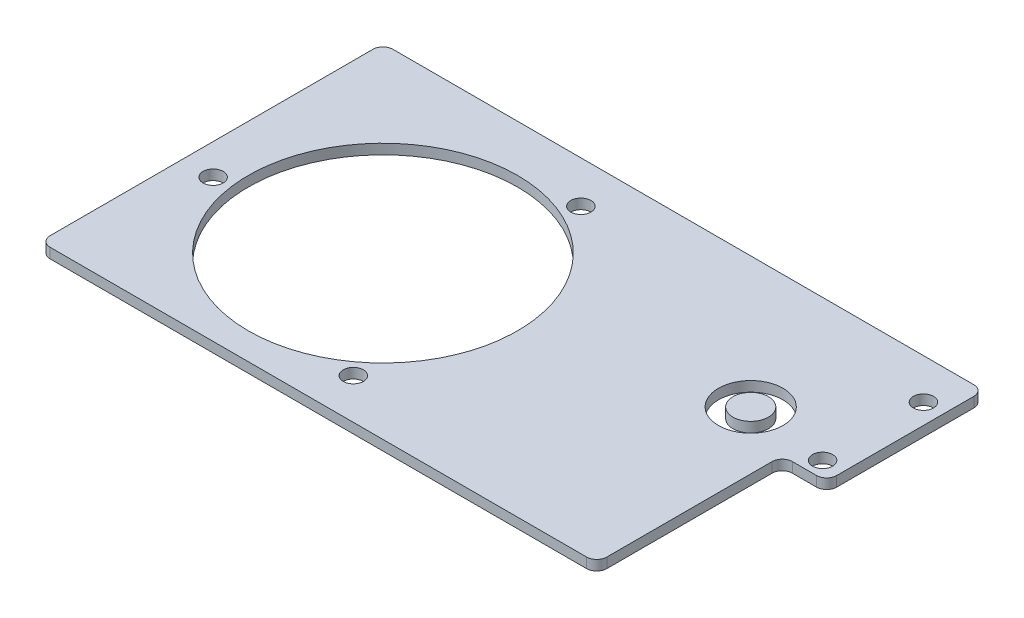
ISO-10303-21;
HEADER;
FILE_DESCRIPTION(('STEP AP214'),'2;1');
FILE_NAME('part.step','',(''),(''),'','','');
FILE_SCHEMA(('AUTOMOTIVE_DESIGN { 1 0 10303 214 1 1 1 1 }'));
ENDSEC;
DATA;
#1=APPLICATION_CONTEXT('core data for automotive mechanical design processes');
#2=APPLICATION_PROTOCOL_DEFINITION('international standard','automotive_design',2000,#1);
#3=PRODUCT_CONTEXT('',#1,'mechanical');
#4=PRODUCT('Part','Part','',(#3));
#5=PRODUCT_RELATED_PRODUCT_CATEGORY('part','',(#4));
#6=PRODUCT_DEFINITION_FORMATION('','',#4);
#7=PRODUCT_DEFINITION_CONTEXT('part definition',#1,'design');
#8=PRODUCT_DEFINITION('design','',#6,#7);
#9=PRODUCT_DEFINITION_SHAPE('','',#8);
#10=(LENGTH_UNIT() NAMED_UNIT(*) SI_UNIT(.MILLI.,.METRE.));
#11=(NAMED_UNIT(*) PLANE_ANGLE_UNIT() SI_UNIT($,.RADIAN.));
#12=(NAMED_UNIT(*) SI_UNIT($,.STERADIAN.) SOLID_ANGLE_UNIT());
#13=UNCERTAINTY_MEASURE_WITH_UNIT(LENGTH_MEASURE(1.E-05),#10,'distance_accuracy_value','');
#14=(GEOMETRIC_REPRESENTATION_CONTEXT(3) GLOBAL_UNCERTAINTY_ASSIGNED_CONTEXT((#13)) GLOBAL_UNIT_ASSIGNED_CONTEXT((#10,
#11,#12)) REPRESENTATION_CONTEXT('',''));
#15=CARTESIAN_POINT('',(0.,0.,0.));
#16=DIRECTION('',(0.,0.,1.));
#17=DIRECTION('',(1.,0.,0.));
#18=AXIS2_PLACEMENT_3D('',#15,#16,#17);
#19=CARTESIAN_POINT('',(242.57,6.35,-8.89000000000004));
#20=DIRECTION('',(0.,-1.,0.));
#21=DIRECTION('',(0.,0.,-1.));
#22=AXIS2_PLACEMENT_3D('',#19,#20,#21);
#23=PLANE('',#22);
#24=CARTESIAN_POINT('',(199.663269188543,6.35,-31.9495832888387));
#25=DIRECTION('',(0.,1.,0.));
#26=DIRECTION('',(0.,0.,1.));
#27=AXIS2_PLACEMENT_3D('',#24,#25,#26);
#28=CIRCLE('',#27,20.32);
#29=CARTESIAN_POINT('',(199.663269188543,6.35,-11.6295832888387));
#30=VERTEX_POINT('',#29);
#31=EDGE_CURVE('E12',#30,#30,#28,.T.);
#32=ORIENTED_EDGE('',*,*,#31,.F.);
#33=EDGE_LOOP('',(#32));
#34=FACE_BOUND('',#33,.T.);
#35=CARTESIAN_POINT('',(242.57,6.35,-8.89000000000004));
#36=DIRECTION('',(0.,-1.,0.));
#37=DIRECTION('',(0.,0.,-1.));
#38=AXIS2_PLACEMENT_3D('',#35,#36,#37);
#39=CIRCLE('',#38,6.35);
#40=CARTESIAN_POINT('',(236.22,6.35,-8.89000000000004));
#41=VERTEX_POINT('',#40);
#42=CARTESIAN_POINT('',(242.57,6.35,-15.24));
#43=VERTEX_POINT('',#42);
#44=EDGE_CURVE('E135',#41,#43,#39,.T.);
#45=ORIENTED_EDGE('',*,*,#44,.T.);
#46=DIRECTION('',(1.,0.,0.));
#47=VECTOR('',#46,1.);
#48=CARTESIAN_POINT('',(242.57,6.35,-15.24));
#49=LINE('',#48,#47);
#50=CARTESIAN_POINT('',(257.81,6.35,-15.2400000000001));
#51=VERTEX_POINT('',#50);
#52=EDGE_CURVE('E128',#43,#51,#49,.T.);
#53=ORIENTED_EDGE('',*,*,#52,.T.);
#54=CARTESIAN_POINT('',(257.81,6.35,-21.59));
#55=DIRECTION('',(0.,1.,0.));
#56=DIRECTION('',(0.,0.,1.));
#57=AXIS2_PLACEMENT_3D('',#54,#55,#56);
#58=CIRCLE('',#57,6.34999999999995);
#59=CARTESIAN_POINT('',(264.16,6.35,-21.59));
#60=VERTEX_POINT('',#59);
#61=EDGE_CURVE('E132',#51,#60,#58,.T.);
#62=ORIENTED_EDGE('',*,*,#61,.T.);
#63=DIRECTION('',(0.,0.,-1.));
#64=VECTOR('',#63,1.);
#65=CARTESIAN_POINT('',(264.16,6.35,-107.95));
#66=LINE('',#65,#64);
#67=CARTESIAN_POINT('',(264.16,6.35,-107.95));
#68=VERTEX_POINT('',#67);
#69=EDGE_CURVE('E153',#60,#68,#66,.T.);
#70=ORIENTED_EDGE('',*,*,#69,.T.);
#71=CARTESIAN_POINT('',(257.81,6.35,-107.95));
#72=DIRECTION('',(0.,1.,0.));
#73=DIRECTION('',(0.,0.,-1.));
#74=AXIS2_PLACEMENT_3D('',#71,#72,#73);
#75=CIRCLE('',#74,6.35000000000002);
#76=CARTESIAN_POINT('',(257.81,6.35,-114.3));
#77=VERTEX_POINT('',#76);
#78=EDGE_CURVE('E155',#68,#77,#75,.T.);
#79=ORIENTED_EDGE('',*,*,#78,.T.);
#80=DIRECTION('',(-1.,0.,0.));
#81=VECTOR('',#80,1.);
#82=CARTESIAN_POINT('',(257.81,6.35,-114.3));
#83=LINE('',#82,#81);
#84=CARTESIAN_POINT('',(-107.95,6.35,-114.3));
#85=VERTEX_POINT('',#84);
#86=EDGE_CURVE('E262',#77,#85,#83,.T.);
#87=ORIENTED_EDGE('',*,*,#86,.T.);
#88=CARTESIAN_POINT('',(-107.95,6.35,-107.95));
#89=DIRECTION('',(0.,1.,0.));
#90=DIRECTION('',(0.,0.,1.));
#91=AXIS2_PLACEMENT_3D('',#88,#89,#90);
#92=CIRCLE('',#91,6.34999999999995);
#93=CARTESIAN_POINT('',(-114.3,6.35,-107.95));
#94=VERTEX_POINT('',#93);
#95=EDGE_CURVE('E260',#85,#94,#92,.T.);
#96=ORIENTED_EDGE('',*,*,#95,.T.);
#97=DIRECTION('',(0.,0.,1.));
#98=VECTOR('',#97,1.);
#99=CARTESIAN_POINT('',(-114.3,6.35,-107.95));
#100=LINE('',#99,#98);
#101=CARTESIAN_POINT('',(-114.3,6.35,95.2500000000002));
#102=VERTEX_POINT('',#101);
#103=EDGE_CURVE('E258',#94,#102,#100,.T.);
#104=ORIENTED_EDGE('',*,*,#103,.T.);
#105=CARTESIAN_POINT('',(-107.95,6.35,95.2500000000002));
#106=DIRECTION('',(0.,1.,0.));
#107=DIRECTION('',(0.,0.,-1.));
#108=AXIS2_PLACEMENT_3D('',#105,#106,#107);
#109=CIRCLE('',#108,6.34999999999996);
#110=CARTESIAN_POINT('',(-107.95,6.35,101.6));
#111=VERTEX_POINT('',#110);
#112=EDGE_CURVE('E256',#102,#111,#109,.T.);
#113=ORIENTED_EDGE('',*,*,#112,.T.);
#114=DIRECTION('',(1.,0.,0.));
#115=VECTOR('',#114,1.);
#116=CARTESIAN_POINT('',(229.87,6.35,101.6));
#117=LINE('',#116,#115);
#118=CARTESIAN_POINT('',(229.87,6.35,101.6));
#119=VERTEX_POINT('',#118);
#120=EDGE_CURVE('E254',#111,#119,#117,.T.);
#121=ORIENTED_EDGE('',*,*,#120,.T.);
#122=CARTESIAN_POINT('',(229.87,6.35,95.25));
#123=DIRECTION('',(0.,1.,0.));
#124=DIRECTION('',(0.,0.,1.));
#125=AXIS2_PLACEMENT_3D('',#122,#123,#124);
#126=CIRCLE('',#125,6.34999999999999);
#127=CARTESIAN_POINT('',(236.22,6.35,95.25));
#128=VERTEX_POINT('',#127);
#129=EDGE_CURVE('E252',#119,#128,#126,.T.);
#130=ORIENTED_EDGE('',*,*,#129,.T.);
#131=DIRECTION('',(0.,0.,-1.));
#132=VECTOR('',#131,1.);
#133=CARTESIAN_POINT('',(236.22,6.35,95.25));
#134=LINE('',#133,#132);
#135=EDGE_CURVE('E190',#128,#41,#134,.T.);
#136=ORIENTED_EDGE('',*,*,#135,.T.);
#137=EDGE_LOOP('',(#45,#53,#62,#70,#79,#87,#96,#104,#113,#121,#130,#136));
#138=FACE_BOUND('',#137,.T.);
#139=CARTESIAN_POINT('',(0.,6.35,0.));
#140=DIRECTION('',(0.,1.,0.));
#141=DIRECTION('',(0.,0.,1.));
#142=AXIS2_PLACEMENT_3D('',#139,#140,#141);
#143=CIRCLE('',#142,84.7725);
#144=CARTESIAN_POINT('',(0.,6.35,84.7725));
#145=VERTEX_POINT('',#144);
#146=EDGE_CURVE('E165',#145,#145,#143,.T.);
#147=ORIENTED_EDGE('',*,*,#146,.F.);
#148=EDGE_LOOP('',(#147));
#149=FACE_BOUND('',#148,.T.);
#150=CARTESIAN_POINT('',(-94.8681670844926,6.35,12.0662470574992));
#151=DIRECTION('',(0.,1.,0.));
#152=DIRECTION('',(0.,0.,1.));
#153=AXIS2_PLACEMENT_3D('',#150,#151,#152);
#154=CIRCLE('',#153,6.35);
#155=CARTESIAN_POINT('',(-94.8681670844926,6.35,18.4162470574992));
#156=VERTEX_POINT('',#155);
#157=EDGE_CURVE('E168',#156,#156,#154,.T.);
#158=ORIENTED_EDGE('',*,*,#157,.F.);
#159=EDGE_LOOP('',(#158));
#160=FACE_BOUND('',#159,.T.);
#161=CARTESIAN_POINT('',(251.46,6.35,-88.9000000000001));
#162=DIRECTION('',(0.,1.,0.));
#163=DIRECTION('',(0.,0.,1.));
#164=AXIS2_PLACEMENT_3D('',#161,#162,#163);
#165=CIRCLE('',#164,6.35);
#166=CARTESIAN_POINT('',(251.46,6.35,-82.5500000000001));
#167=VERTEX_POINT('',#166);
#168=EDGE_CURVE('E175',#167,#167,#165,.T.);
#169=ORIENTED_EDGE('',*,*,#168,.F.);
#170=EDGE_LOOP('',(#169));
#171=FACE_BOUND('',#170,.T.);
#172=CARTESIAN_POINT('',(251.46,6.35,-25.4000000000001));
#173=DIRECTION('',(0.,1.,0.));
#174=DIRECTION('',(0.,0.,1.));
#175=AXIS2_PLACEMENT_3D('',#172,#173,#174);
#176=CIRCLE('',#175,6.35);
#177=CARTESIAN_POINT('',(251.46,6.35,-19.0500000000001));
#178=VERTEX_POINT('',#177);
#179=EDGE_CURVE('E181',#178,#178,#176,.T.);
#180=ORIENTED_EDGE('',*,*,#179,.F.);
#181=EDGE_LOOP('',(#180));
#182=FACE_BOUND('',#181,.T.);
#183=CARTESIAN_POINT('',(36.7916406639406,6.35,-87.8574850383021));
#184=DIRECTION('',(0.,1.,0.));
#185=DIRECTION('',(0.,0.,1.));
#186=AXIS2_PLACEMENT_3D('',#183,#184,#185);
#187=CIRCLE('',#186,6.34999999999998);
#188=CARTESIAN_POINT('',(36.7916406639406,6.35,-81.5074850383022));
#189=VERTEX_POINT('',#188);
#190=EDGE_CURVE('E187',#189,#189,#187,.T.);
#191=ORIENTED_EDGE('',*,*,#190,.F.);
#192=EDGE_LOOP('',(#191));
#193=FACE_BOUND('',#192,.T.);
#194=CARTESIAN_POINT('',(57.4982272256385,6.35,76.125119177117));
#195=DIRECTION('',(0.,1.,0.));
#196=DIRECTION('',(0.,0.,1.));
#197=AXIS2_PLACEMENT_3D('',#194,#195,#196);
#198=CIRCLE('',#197,6.35);
#199=CARTESIAN_POINT('',(57.4982272256385,6.35,82.475119177117));
#200=VERTEX_POINT('',#199);
#201=EDGE_CURVE('E193',#200,#200,#198,.T.);
#202=ORIENTED_EDGE('',*,*,#201,.F.);
#203=EDGE_LOOP('',(#202));
#204=FACE_BOUND('',#203,.T.);
#205=ADVANCED_FACE('F43',(#34,#138,#149,#160,#171,#182,#193,#204),#23,.F.);
#206=CARTESIAN_POINT('',(242.57,0.,-8.89000000000004));
#207=DIRECTION('',(0.,-1.,0.));
#208=DIRECTION('',(0.,0.,-1.));
#209=AXIS2_PLACEMENT_3D('',#206,#207,#208);
#210=PLANE('',#209);
#211=CARTESIAN_POINT('',(199.663269188543,0.,-31.9495832888387));
#212=DIRECTION('',(0.,-1.,0.));
#213=DIRECTION('',(0.,0.,-1.));
#214=AXIS2_PLACEMENT_3D('',#211,#212,#213);
#215=CIRCLE('',#214,20.32);
#216=CARTESIAN_POINT('',(199.663269188543,0.,-52.2695832888387));
#217=VERTEX_POINT('',#216);
#218=EDGE_CURVE('E51',#217,#217,#215,.T.);
#219=ORIENTED_EDGE('',*,*,#218,.F.);
#220=EDGE_LOOP('',(#219));
#221=FACE_BOUND('',#220,.T.);
#222=CARTESIAN_POINT('',(36.7916406639406,0.,-87.8574850383021));
#223=DIRECTION('',(0.,1.,0.));
#224=DIRECTION('',(0.,0.,1.));
#225=AXIS2_PLACEMENT_3D('',#222,#223,#224);
#226=CIRCLE('',#225,6.34999999999998);
#227=CARTESIAN_POINT('',(36.7916406639406,0.,-81.5074850383022));
#228=VERTEX_POINT('',#227);
#229=EDGE_CURVE('E178',#228,#228,#226,.T.);
#230=ORIENTED_EDGE('',*,*,#229,.T.);
#231=EDGE_LOOP('',(#230));
#232=FACE_BOUND('',#231,.T.);
#233=CARTESIAN_POINT('',(251.46,0.,-88.9000000000001));
#234=DIRECTION('',(0.,1.,0.));
#235=DIRECTION('',(0.,0.,1.));
#236=AXIS2_PLACEMENT_3D('',#233,#234,#235);
#237=CIRCLE('',#236,6.35);
#238=CARTESIAN_POINT('',(251.46,0.,-82.5500000000001));
#239=VERTEX_POINT('',#238);
#240=EDGE_CURVE('E164',#239,#239,#237,.T.);
#241=ORIENTED_EDGE('',*,*,#240,.T.);
#242=EDGE_LOOP('',(#241));
#243=FACE_BOUND('',#242,.T.);
#244=CARTESIAN_POINT('',(0.,0.,0.));
#245=DIRECTION('',(0.,1.,0.));
#246=DIRECTION('',(0.,0.,1.));
#247=AXIS2_PLACEMENT_3D('',#244,#245,#246);
#248=CIRCLE('',#247,84.7725);
#249=CARTESIAN_POINT('',(0.,0.,84.7725));
#250=VERTEX_POINT('',#249);
#251=EDGE_CURVE('E160',#250,#250,#248,.T.);
#252=ORIENTED_EDGE('',*,*,#251,.T.);
#253=EDGE_LOOP('',(#252));
#254=FACE_BOUND('',#253,.T.);
#255=CARTESIAN_POINT('',(242.57,0.,-8.89000000000004));
#256=DIRECTION('',(0.,-1.,0.));
#257=DIRECTION('',(0.,0.,-1.));
#258=AXIS2_PLACEMENT_3D('',#255,#256,#257);
#259=CIRCLE('',#258,6.35);
#260=CARTESIAN_POINT('',(236.22,0.,-8.89000000000004));
#261=VERTEX_POINT('',#260);
#262=CARTESIAN_POINT('',(242.57,0.,-15.24));
#263=VERTEX_POINT('',#262);
#264=EDGE_CURVE('E195',#261,#263,#259,.T.);
#265=ORIENTED_EDGE('',*,*,#264,.F.);
#266=DIRECTION('',(0.,0.,-1.));
#267=VECTOR('',#266,1.);
#268=CARTESIAN_POINT('',(236.22,0.,95.25));
#269=LINE('',#268,#267);
#270=CARTESIAN_POINT('',(236.22,0.,95.25));
#271=VERTEX_POINT('',#270);
#272=EDGE_CURVE('E59',#271,#261,#269,.T.);
#273=ORIENTED_EDGE('',*,*,#272,.F.);
#274=CARTESIAN_POINT('',(229.87,0.,95.25));
#275=DIRECTION('',(0.,1.,0.));
#276=DIRECTION('',(0.,0.,1.));
#277=AXIS2_PLACEMENT_3D('',#274,#275,#276);
#278=CIRCLE('',#277,6.34999999999999);
#279=CARTESIAN_POINT('',(229.87,0.,101.6));
#280=VERTEX_POINT('',#279);
#281=EDGE_CURVE('E231',#280,#271,#278,.T.);
#282=ORIENTED_EDGE('',*,*,#281,.F.);
#283=DIRECTION('',(1.,0.,0.));
#284=VECTOR('',#283,1.);
#285=CARTESIAN_POINT('',(229.87,0.,101.6));
#286=LINE('',#285,#284);
#287=CARTESIAN_POINT('',(-107.95,0.,101.6));
#288=VERTEX_POINT('',#287);
#289=EDGE_CURVE('E227',#288,#280,#286,.T.);
#290=ORIENTED_EDGE('',*,*,#289,.F.);
#291=CARTESIAN_POINT('',(-107.95,0.,95.2500000000002));
#292=DIRECTION('',(0.,1.,0.));
#293=DIRECTION('',(0.,0.,-1.));
#294=AXIS2_PLACEMENT_3D('',#291,#292,#293);
#295=CIRCLE('',#294,6.34999999999996);
#296=CARTESIAN_POINT('',(-114.3,0.,95.2500000000002));
#297=VERTEX_POINT('',#296);
#298=EDGE_CURVE('E223',#297,#288,#295,.T.);
#299=ORIENTED_EDGE('',*,*,#298,.F.);
#300=DIRECTION('',(0.,0.,1.));
#301=VECTOR('',#300,1.);
#302=CARTESIAN_POINT('',(-114.3,0.,-107.95));
#303=LINE('',#302,#301);
#304=CARTESIAN_POINT('',(-114.3,0.,-107.95));
#305=VERTEX_POINT('',#304);
#306=EDGE_CURVE('E219',#305,#297,#303,.T.);
#307=ORIENTED_EDGE('',*,*,#306,.F.);
#308=CARTESIAN_POINT('',(-107.95,0.,-107.95));
#309=DIRECTION('',(0.,1.,0.));
#310=DIRECTION('',(0.,0.,1.));
#311=AXIS2_PLACEMENT_3D('',#308,#309,#310);
#312=CIRCLE('',#311,6.34999999999995);
#313=CARTESIAN_POINT('',(-107.95,0.,-114.3));
#314=VERTEX_POINT('',#313);
#315=EDGE_CURVE('E215',#314,#305,#312,.T.);
#316=ORIENTED_EDGE('',*,*,#315,.F.);
#317=DIRECTION('',(-1.,0.,0.));
#318=VECTOR('',#317,1.);
#319=CARTESIAN_POINT('',(257.81,0.,-114.3));
#320=LINE('',#319,#318);
#321=CARTESIAN_POINT('',(257.81,0.,-114.3));
#322=VERTEX_POINT('',#321);
#323=EDGE_CURVE('E211',#322,#314,#320,.T.);
#324=ORIENTED_EDGE('',*,*,#323,.F.);
#325=CARTESIAN_POINT('',(257.81,0.,-107.95));
#326=DIRECTION('',(0.,1.,0.));
#327=DIRECTION('',(0.,0.,-1.));
#328=AXIS2_PLACEMENT_3D('',#325,#326,#327);
#329=CIRCLE('',#328,6.35000000000002);
#330=CARTESIAN_POINT('',(264.16,0.,-107.95));
#331=VERTEX_POINT('',#330);
#332=EDGE_CURVE('E207',#331,#322,#329,.T.);
#333=ORIENTED_EDGE('',*,*,#332,.F.);
#334=DIRECTION('',(0.,0.,-1.));
#335=VECTOR('',#334,1.);
#336=CARTESIAN_POINT('',(264.16,0.,-107.95));
#337=LINE('',#336,#335);
#338=CARTESIAN_POINT('',(264.16,0.,-21.59));
#339=VERTEX_POINT('',#338);
#340=EDGE_CURVE('E146',#339,#331,#337,.T.);
#341=ORIENTED_EDGE('',*,*,#340,.F.);
#342=CARTESIAN_POINT('',(257.81,0.,-21.59));
#343=DIRECTION('',(0.,1.,0.));
#344=DIRECTION('',(0.,0.,1.));
#345=AXIS2_PLACEMENT_3D('',#342,#343,#344);
#346=CIRCLE('',#345,6.34999999999995);
#347=CARTESIAN_POINT('',(257.81,0.,-15.2400000000001));
#348=VERTEX_POINT('',#347);
#349=EDGE_CURVE('E147',#348,#339,#346,.T.);
#350=ORIENTED_EDGE('',*,*,#349,.F.);
#351=DIRECTION('',(1.,0.,0.));
#352=VECTOR('',#351,1.);
#353=CARTESIAN_POINT('',(242.57,0.,-15.24));
#354=LINE('',#353,#352);
#355=EDGE_CURVE('E143',#263,#348,#354,.T.);
#356=ORIENTED_EDGE('',*,*,#355,.F.);
#357=EDGE_LOOP('',(#265,#273,#282,#290,#299,#307,#316,#324,#333,#341,#350,#356));
#358=FACE_BOUND('',#357,.T.);
#359=CARTESIAN_POINT('',(-94.8681670844926,0.,12.0662470574992));
#360=DIRECTION('',(0.,1.,0.));
#361=DIRECTION('',(0.,0.,1.));
#362=AXIS2_PLACEMENT_3D('',#359,#360,#361);
#363=CIRCLE('',#362,6.35);
#364=CARTESIAN_POINT('',(-94.8681670844926,0.,18.4162470574992));
#365=VERTEX_POINT('',#364);
#366=EDGE_CURVE('E163',#365,#365,#363,.T.);
#367=ORIENTED_EDGE('',*,*,#366,.T.);
#368=EDGE_LOOP('',(#367));
#369=FACE_BOUND('',#368,.T.);
#370=CARTESIAN_POINT('',(251.46,0.,-25.4000000000001));
#371=DIRECTION('',(0.,1.,0.));
#372=DIRECTION('',(0.,0.,1.));
#373=AXIS2_PLACEMENT_3D('',#370,#371,#372);
#374=CIRCLE('',#373,6.35);
#375=CARTESIAN_POINT('',(251.46,0.,-19.0500000000001));
#376=VERTEX_POINT('',#375);
#377=EDGE_CURVE('E172',#376,#376,#374,.T.);
#378=ORIENTED_EDGE('',*,*,#377,.T.);
#379=EDGE_LOOP('',(#378));
#380=FACE_BOUND('',#379,.T.);
#381=CARTESIAN_POINT('',(57.4982272256385,0.,76.125119177117));
#382=DIRECTION('',(0.,1.,0.));
#383=DIRECTION('',(0.,0.,1.));
#384=AXIS2_PLACEMENT_3D('',#381,#382,#383);
#385=CIRCLE('',#384,6.35);
#386=CARTESIAN_POINT('',(57.4982272256385,0.,82.475119177117));
#387=VERTEX_POINT('',#386);
#388=EDGE_CURVE('E184',#387,#387,#385,.T.);
#389=ORIENTED_EDGE('',*,*,#388,.T.);
#390=EDGE_LOOP('',(#389));
#391=FACE_BOUND('',#390,.T.);
#392=ADVANCED_FACE('F305',(#221,#232,#243,#254,#358,#369,#380,#391),#210,.T.);
#393=CARTESIAN_POINT('',(242.57,6.35,-8.89000000000004));
#394=DIRECTION('',(0.,-1.,0.));
#395=DIRECTION('',(0.,0.,-1.));
#396=AXIS2_PLACEMENT_3D('',#393,#394,#395);
#397=CYLINDRICAL_SURFACE('',#396,6.35);
#398=ORIENTED_EDGE('',*,*,#264,.T.);
#399=DIRECTION('',(0.,-1.,0.));
#400=VECTOR('',#399,1.);
#401=CARTESIAN_POINT('',(242.57,6.35,-15.24));
#402=LINE('',#401,#400);
#403=EDGE_CURVE('E204',#43,#263,#402,.T.);
#404=ORIENTED_EDGE('',*,*,#403,.F.);
#405=ORIENTED_EDGE('',*,*,#44,.F.);
#406=DIRECTION('',(0.,-1.,0.));
#407=VECTOR('',#406,1.);
#408=CARTESIAN_POINT('',(236.22,6.35,-8.89000000000004));
#409=LINE('',#408,#407);
#410=EDGE_CURVE('E236',#41,#261,#409,.T.);
#411=ORIENTED_EDGE('',*,*,#410,.T.);
#412=EDGE_LOOP('',(#398,#404,#405,#411));
#413=FACE_BOUND('',#412,.T.);
#414=ADVANCED_FACE('F303',(#413),#397,.F.);
#415=CARTESIAN_POINT('',(242.57,6.35,-15.24));
#416=DIRECTION('',(0.,0.,-1.));
#417=DIRECTION('',(-1.,0.,0.));
#418=AXIS2_PLACEMENT_3D('',#415,#416,#417);
#419=PLANE('',#418);
#420=ORIENTED_EDGE('',*,*,#355,.T.);
#421=DIRECTION('',(0.,-1.,0.));
#422=VECTOR('',#421,1.);
#423=CARTESIAN_POINT('',(257.81,6.35,-15.2400000000001));
#424=LINE('',#423,#422);
#425=EDGE_CURVE('E141',#51,#348,#424,.T.);
#426=ORIENTED_EDGE('',*,*,#425,.F.);
#427=ORIENTED_EDGE('',*,*,#52,.F.);
#428=ORIENTED_EDGE('',*,*,#403,.T.);
#429=EDGE_LOOP('',(#420,#426,#427,#428));
#430=FACE_BOUND('',#429,.T.);
#431=ADVANCED_FACE('F142',(#430),#419,.F.);
#432=CARTESIAN_POINT('',(257.81,6.35,-21.59));
#433=DIRECTION('',(0.,-1.,0.));
#434=DIRECTION('',(0.,0.,-1.));
#435=AXIS2_PLACEMENT_3D('',#432,#433,#434);
#436=CYLINDRICAL_SURFACE('',#435,6.34999999999995);
#437=ORIENTED_EDGE('',*,*,#349,.T.);
#438=DIRECTION('',(0.,-1.,0.));
#439=VECTOR('',#438,1.);
#440=CARTESIAN_POINT('',(264.16,6.35,-21.59));
#441=LINE('',#440,#439);
#442=EDGE_CURVE('E151',#60,#339,#441,.T.);
#443=ORIENTED_EDGE('',*,*,#442,.F.);
#444=ORIENTED_EDGE('',*,*,#61,.F.);
#445=ORIENTED_EDGE('',*,*,#425,.T.);
#446=EDGE_LOOP('',(#437,#443,#444,#445));
#447=FACE_BOUND('',#446,.T.);
#448=ADVANCED_FACE('F149',(#447),#436,.T.);
#449=CARTESIAN_POINT('',(264.16,6.35,-107.95));
#450=DIRECTION('',(-1.,0.,0.));
#451=DIRECTION('',(0.,0.,1.));
#452=AXIS2_PLACEMENT_3D('',#449,#450,#451);
#453=PLANE('',#452);
#454=ORIENTED_EDGE('',*,*,#340,.T.);
#455=DIRECTION('',(0.,-1.,0.));
#456=VECTOR('',#455,1.);
#457=CARTESIAN_POINT('',(264.16,6.35,-107.95));
#458=LINE('',#457,#456);
#459=EDGE_CURVE('E208',#68,#331,#458,.T.);
#460=ORIENTED_EDGE('',*,*,#459,.F.);
#461=ORIENTED_EDGE('',*,*,#69,.F.);
#462=ORIENTED_EDGE('',*,*,#442,.T.);
#463=EDGE_LOOP('',(#454,#460,#461,#462));
#464=FACE_BOUND('',#463,.T.);
#465=ADVANCED_FACE('F309',(#464),#453,.F.);
#466=CARTESIAN_POINT('',(257.81,6.35,-107.95));
#467=DIRECTION('',(0.,-1.,0.));
#468=DIRECTION('',(0.,0.,-1.));
#469=AXIS2_PLACEMENT_3D('',#466,#467,#468);
#470=CYLINDRICAL_SURFACE('',#469,6.35000000000002);
#471=ORIENTED_EDGE('',*,*,#332,.T.);
#472=DIRECTION('',(0.,-1.,0.));
#473=VECTOR('',#472,1.);
#474=CARTESIAN_POINT('',(257.81,6.35,-114.3));
#475=LINE('',#474,#473);
#476=EDGE_CURVE('E212',#77,#322,#475,.T.);
#477=ORIENTED_EDGE('',*,*,#476,.F.);
#478=ORIENTED_EDGE('',*,*,#78,.F.);
#479=ORIENTED_EDGE('',*,*,#459,.T.);
#480=EDGE_LOOP('',(#471,#477,#478,#479));
#481=FACE_BOUND('',#480,.T.);
#482=ADVANCED_FACE('F269',(#481),#470,.T.);
#483=CARTESIAN_POINT('',(257.81,6.35,-114.3));
#484=DIRECTION('',(0.,0.,1.));
#485=DIRECTION('',(1.,0.,0.));
#486=AXIS2_PLACEMENT_3D('',#483,#484,#485);
#487=PLANE('',#486);
#488=ORIENTED_EDGE('',*,*,#323,.T.);
#489=DIRECTION('',(0.,-1.,0.));
#490=VECTOR('',#489,1.);
#491=CARTESIAN_POINT('',(-107.95,6.35,-114.3));
#492=LINE('',#491,#490);
#493=EDGE_CURVE('E216',#85,#314,#492,.T.);
#494=ORIENTED_EDGE('',*,*,#493,.F.);
#495=ORIENTED_EDGE('',*,*,#86,.F.);
#496=ORIENTED_EDGE('',*,*,#476,.T.);
#497=EDGE_LOOP('',(#488,#494,#495,#496));
#498=FACE_BOUND('',#497,.T.);
#499=ADVANCED_FACE('F273',(#498),#487,.F.);
#500=CARTESIAN_POINT('',(-107.95,6.35,-107.95));
#501=DIRECTION('',(0.,-1.,0.));
#502=DIRECTION('',(0.,0.,-1.));
#503=AXIS2_PLACEMENT_3D('',#500,#501,#502);
#504=CYLINDRICAL_SURFACE('',#503,6.34999999999995);
#505=ORIENTED_EDGE('',*,*,#315,.T.);
#506=DIRECTION('',(0.,-1.,0.));
#507=VECTOR('',#506,1.);
#508=CARTESIAN_POINT('',(-114.3,6.35,-107.95));
#509=LINE('',#508,#507);
#510=EDGE_CURVE('E220',#94,#305,#509,.T.);
#511=ORIENTED_EDGE('',*,*,#510,.F.);
#512=ORIENTED_EDGE('',*,*,#95,.F.);
#513=ORIENTED_EDGE('',*,*,#493,.T.);
#514=EDGE_LOOP('',(#505,#511,#512,#513));
#515=FACE_BOUND('',#514,.T.);
#516=ADVANCED_FACE('F278',(#515),#504,.T.);
#517=CARTESIAN_POINT('',(-114.3,6.35,-107.95));
#518=DIRECTION('',(1.,0.,0.));
#519=DIRECTION('',(0.,0.,-1.));
#520=AXIS2_PLACEMENT_3D('',#517,#518,#519);
#521=PLANE('',#520);
#522=ORIENTED_EDGE('',*,*,#306,.T.);
#523=DIRECTION('',(0.,-1.,0.));
#524=VECTOR('',#523,1.);
#525=CARTESIAN_POINT('',(-114.3,6.35,95.2500000000002));
#526=LINE('',#525,#524);
#527=EDGE_CURVE('E224',#102,#297,#526,.T.);
#528=ORIENTED_EDGE('',*,*,#527,.F.);
#529=ORIENTED_EDGE('',*,*,#103,.F.);
#530=ORIENTED_EDGE('',*,*,#510,.T.);
#531=EDGE_LOOP('',(#522,#528,#529,#530));
#532=FACE_BOUND('',#531,.T.);
#533=ADVANCED_FACE('F284',(#532),#521,.F.);
#534=CARTESIAN_POINT('',(-107.95,6.35,95.2500000000002));
#535=DIRECTION('',(0.,-1.,0.));
#536=DIRECTION('',(0.,0.,-1.));
#537=AXIS2_PLACEMENT_3D('',#534,#535,#536);
#538=CYLINDRICAL_SURFACE('',#537,6.34999999999996);
#539=ORIENTED_EDGE('',*,*,#298,.T.);
#540=DIRECTION('',(0.,-1.,0.));
#541=VECTOR('',#540,1.);
#542=CARTESIAN_POINT('',(-107.95,6.35,101.6));
#543=LINE('',#542,#541);
#544=EDGE_CURVE('E228',#111,#288,#543,.T.);
#545=ORIENTED_EDGE('',*,*,#544,.F.);
#546=ORIENTED_EDGE('',*,*,#112,.F.);
#547=ORIENTED_EDGE('',*,*,#527,.T.);
#548=EDGE_LOOP('',(#539,#545,#546,#547));
#549=FACE_BOUND('',#548,.T.);
#550=ADVANCED_FACE('F288',(#549),#538,.T.);
#551=CARTESIAN_POINT('',(229.87,6.35,101.6));
#552=DIRECTION('',(0.,0.,-1.));
#553=DIRECTION('',(-1.,0.,0.));
#554=AXIS2_PLACEMENT_3D('',#551,#552,#553);
#555=PLANE('',#554);
#556=ORIENTED_EDGE('',*,*,#289,.T.);
#557=DIRECTION('',(0.,-1.,0.));
#558=VECTOR('',#557,1.);
#559=CARTESIAN_POINT('',(229.87,6.35,101.6));
#560=LINE('',#559,#558);
#561=EDGE_CURVE('E232',#119,#280,#560,.T.);
#562=ORIENTED_EDGE('',*,*,#561,.F.);
#563=ORIENTED_EDGE('',*,*,#120,.F.);
#564=ORIENTED_EDGE('',*,*,#544,.T.);
#565=EDGE_LOOP('',(#556,#562,#563,#564));
#566=FACE_BOUND('',#565,.T.);
#567=ADVANCED_FACE('F293',(#566),#555,.F.);
#568=CARTESIAN_POINT('',(229.87,6.35,95.25));
#569=DIRECTION('',(0.,-1.,0.));
#570=DIRECTION('',(0.,0.,-1.));
#571=AXIS2_PLACEMENT_3D('',#568,#569,#570);
#572=CYLINDRICAL_SURFACE('',#571,6.34999999999999);
#573=ORIENTED_EDGE('',*,*,#281,.T.);
#574=DIRECTION('',(0.,-1.,0.));
#575=VECTOR('',#574,1.);
#576=CARTESIAN_POINT('',(236.22,6.35,95.25));
#577=LINE('',#576,#575);
#578=EDGE_CURVE('E169',#128,#271,#577,.T.);
#579=ORIENTED_EDGE('',*,*,#578,.F.);
#580=ORIENTED_EDGE('',*,*,#129,.F.);
#581=ORIENTED_EDGE('',*,*,#561,.T.);
#582=EDGE_LOOP('',(#573,#579,#580,#581));
#583=FACE_BOUND('',#582,.T.);
#584=ADVANCED_FACE('F298',(#583),#572,.T.);
#585=CARTESIAN_POINT('',(236.22,6.35,95.25));
#586=DIRECTION('',(-1.,0.,0.));
#587=DIRECTION('',(0.,0.,1.));
#588=AXIS2_PLACEMENT_3D('',#585,#586,#587);
#589=PLANE('',#588);
#590=ORIENTED_EDGE('',*,*,#272,.T.);
#591=ORIENTED_EDGE('',*,*,#410,.F.);
#592=ORIENTED_EDGE('',*,*,#135,.F.);
#593=ORIENTED_EDGE('',*,*,#578,.T.);
#594=EDGE_LOOP('',(#590,#591,#592,#593));
#595=FACE_BOUND('',#594,.T.);
#596=ADVANCED_FACE('F300',(#595),#589,.F.);
#597=CARTESIAN_POINT('',(0.,6.35,0.));
#598=DIRECTION('',(0.,-1.,0.));
#599=DIRECTION('',(0.,0.,-1.));
#600=AXIS2_PLACEMENT_3D('',#597,#598,#599);
#601=CYLINDRICAL_SURFACE('',#600,84.7725);
#602=ORIENTED_EDGE('',*,*,#146,.T.);
#603=EDGE_LOOP('',(#602));
#604=FACE_BOUND('',#603,.T.);
#605=ORIENTED_EDGE('',*,*,#251,.F.);
#606=EDGE_LOOP('',(#605));
#607=FACE_BOUND('',#606,.T.);
#608=ADVANCED_FACE('F350',(#604,#607),#601,.F.);
#609=CARTESIAN_POINT('',(-94.8681670844926,6.35,12.0662470574992));
#610=DIRECTION('',(0.,-1.,0.));
#611=DIRECTION('',(0.,0.,-1.));
#612=AXIS2_PLACEMENT_3D('',#609,#610,#611);
#613=CYLINDRICAL_SURFACE('',#612,6.35);
#614=ORIENTED_EDGE('',*,*,#157,.T.);
#615=EDGE_LOOP('',(#614));
#616=FACE_BOUND('',#615,.T.);
#617=ORIENTED_EDGE('',*,*,#366,.F.);
#618=EDGE_LOOP('',(#617));
#619=FACE_BOUND('',#618,.T.);
#620=ADVANCED_FACE('F346',(#616,#619),#613,.F.);
#621=CARTESIAN_POINT('',(251.46,6.35,-88.9000000000001));
#622=DIRECTION('',(0.,-1.,0.));
#623=DIRECTION('',(0.,0.,-1.));
#624=AXIS2_PLACEMENT_3D('',#621,#622,#623);
#625=CYLINDRICAL_SURFACE('',#624,6.35);
#626=ORIENTED_EDGE('',*,*,#168,.T.);
#627=EDGE_LOOP('',(#626));
#628=FACE_BOUND('',#627,.T.);
#629=ORIENTED_EDGE('',*,*,#240,.F.);
#630=EDGE_LOOP('',(#629));
#631=FACE_BOUND('',#630,.T.);
#632=ADVANCED_FACE('F342',(#628,#631),#625,.F.);
#633=CARTESIAN_POINT('',(251.46,6.35,-25.4000000000001));
#634=DIRECTION('',(0.,-1.,0.));
#635=DIRECTION('',(0.,0.,-1.));
#636=AXIS2_PLACEMENT_3D('',#633,#634,#635);
#637=CYLINDRICAL_SURFACE('',#636,6.35);
#638=ORIENTED_EDGE('',*,*,#179,.T.);
#639=EDGE_LOOP('',(#638));
#640=FACE_BOUND('',#639,.T.);
#641=ORIENTED_EDGE('',*,*,#377,.F.);
#642=EDGE_LOOP('',(#641));
#643=FACE_BOUND('',#642,.T.);
#644=ADVANCED_FACE('F338',(#640,#643),#637,.F.);
#645=CARTESIAN_POINT('',(36.7916406639406,6.35,-87.8574850383021));
#646=DIRECTION('',(0.,-1.,0.));
#647=DIRECTION('',(0.,0.,-1.));
#648=AXIS2_PLACEMENT_3D('',#645,#646,#647);
#649=CYLINDRICAL_SURFACE('',#648,6.34999999999998);
#650=ORIENTED_EDGE('',*,*,#190,.T.);
#651=EDGE_LOOP('',(#650));
#652=FACE_BOUND('',#651,.T.);
#653=ORIENTED_EDGE('',*,*,#229,.F.);
#654=EDGE_LOOP('',(#653));
#655=FACE_BOUND('',#654,.T.);
#656=ADVANCED_FACE('F333',(#652,#655),#649,.F.);
#657=CARTESIAN_POINT('',(57.4982272256385,6.35,76.125119177117));
#658=DIRECTION('',(0.,-1.,0.));
#659=DIRECTION('',(0.,0.,-1.));
#660=AXIS2_PLACEMENT_3D('',#657,#658,#659);
#661=CYLINDRICAL_SURFACE('',#660,6.35);
#662=ORIENTED_EDGE('',*,*,#201,.T.);
#663=EDGE_LOOP('',(#662));
#664=FACE_BOUND('',#663,.T.);
#665=ORIENTED_EDGE('',*,*,#388,.F.);
#666=EDGE_LOOP('',(#665));
#667=FACE_BOUND('',#666,.T.);
#668=ADVANCED_FACE('F328',(#664,#667),#661,.F.);
#669=CARTESIAN_POINT('',(199.663269188543,-3.302,-31.9495832888387));
#670=DIRECTION('',(0.,1.,0.));
#671=DIRECTION('',(0.,0.,1.));
#672=AXIS2_PLACEMENT_3D('',#669,#670,#671);
#673=CYLINDRICAL_SURFACE('',#672,20.32);
#674=ORIENTED_EDGE('',*,*,#218,.T.);
#675=EDGE_LOOP('',(#674));
#676=FACE_BOUND('',#675,.T.);
#677=ORIENTED_EDGE('',*,*,#31,.T.);
#678=EDGE_LOOP('',(#677));
#679=FACE_BOUND('',#678,.T.);
#680=ADVANCED_FACE('F326',(#676,#679),#673,.F.);
#681=CLOSED_SHELL('',(#205,#392,#414,#431,#448,#465,#482,#499,#516,#533,#550,#567,#584,#596,
#608,#620,#632,#644,#656,#668,#680));
#682=MANIFOLD_SOLID_BREP('B2',#681);
#683=CARTESIAN_POINT('',(242.57,0.,-8.89000000000004));
#684=DIRECTION('',(0.,-1.,0.));
#685=DIRECTION('',(0.,0.,-1.));
#686=AXIS2_PLACEMENT_3D('',#683,#684,#685);
#687=PLANE('',#686);
#688=CARTESIAN_POINT('',(199.663269188543,0.,-31.9495832888387));
#689=DIRECTION('',(0.,-1.,0.));
#690=DIRECTION('',(0.,0.,-1.));
#691=AXIS2_PLACEMENT_3D('',#688,#689,#690);
#692=CIRCLE('',#691,11.176);
#693=CARTESIAN_POINT('',(199.663269188543,0.,-43.1255832888387));
#694=VERTEX_POINT('',#693);
#695=EDGE_CURVE('E42',#694,#694,#692,.T.);
#696=ORIENTED_EDGE('',*,*,#695,.T.);
#697=EDGE_LOOP('',(#696));
#698=FACE_BOUND('',#697,.T.);
#699=ADVANCED_FACE('F534',(#698),#687,.T.);
#700=CARTESIAN_POINT('',(199.663269188543,-3.302,-31.9495832888387));
#701=DIRECTION('',(0.,1.,0.));
#702=DIRECTION('',(0.,0.,1.));
#703=AXIS2_PLACEMENT_3D('',#700,#701,#702);
#704=CYLINDRICAL_SURFACE('',#703,11.176);
#705=ORIENTED_EDGE('',*,*,#695,.F.);
#706=EDGE_LOOP('',(#705));
#707=FACE_BOUND('',#706,.T.);
#708=CARTESIAN_POINT('',(199.663269188543,6.35,-31.9495832888387));
#709=DIRECTION('',(0.,1.,0.));
#710=DIRECTION('',(0.,0.,1.));
#711=AXIS2_PLACEMENT_3D('',#708,#709,#710);
#712=CIRCLE('',#711,11.176);
#713=CARTESIAN_POINT('',(199.663269188543,6.35,-20.7735832888387));
#714=VERTEX_POINT('',#713);
#715=EDGE_CURVE('E540',#714,#714,#712,.T.);
#716=ORIENTED_EDGE('',*,*,#715,.F.);
#717=EDGE_LOOP('',(#716));
#718=FACE_BOUND('',#717,.T.);
#719=ADVANCED_FACE('F548',(#707,#718),#704,.T.);
#720=CARTESIAN_POINT('',(242.57,6.35,-8.89000000000004));
#721=DIRECTION('',(0.,-1.,0.));
#722=DIRECTION('',(0.,0.,-1.));
#723=AXIS2_PLACEMENT_3D('',#720,#721,#722);
#724=PLANE('',#723);
#725=ORIENTED_EDGE('',*,*,#715,.T.);
#726=EDGE_LOOP('',(#725));
#727=FACE_BOUND('',#726,.T.);
#728=ADVANCED_FACE('F546',(#727),#724,.F.);
#729=CLOSED_SHELL('',(#699,#719,#728));
#730=MANIFOLD_SOLID_BREP('B6',#729);
#731=ADVANCED_BREP_SHAPE_REPRESENTATION('',(#18,#682,#730),#14);
#732=SHAPE_DEFINITION_REPRESENTATION(#9,#731);
ENDSEC;
END-ISO-10303-21;
